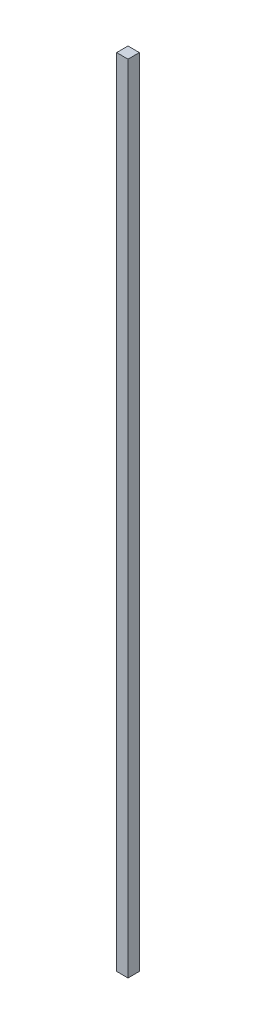
ISO-10303-21;
HEADER;
FILE_DESCRIPTION(('STEP AP214'),'2;1');
FILE_NAME('part.step','',(''),(''),'','','');
FILE_SCHEMA(('AUTOMOTIVE_DESIGN { 1 0 10303 214 1 1 1 1 }'));
ENDSEC;
DATA;
#1=APPLICATION_CONTEXT('core data for automotive mechanical design processes');
#2=APPLICATION_PROTOCOL_DEFINITION('international standard','automotive_design',2000,#1);
#3=PRODUCT_CONTEXT('',#1,'mechanical');
#4=PRODUCT('Part','Part','',(#3));
#5=PRODUCT_RELATED_PRODUCT_CATEGORY('part','',(#4));
#6=PRODUCT_DEFINITION_FORMATION('','',#4);
#7=PRODUCT_DEFINITION_CONTEXT('part definition',#1,'design');
#8=PRODUCT_DEFINITION('design','',#6,#7);
#9=PRODUCT_DEFINITION_SHAPE('','',#8);
#10=(LENGTH_UNIT() NAMED_UNIT(*) SI_UNIT(.MILLI.,.METRE.));
#11=(NAMED_UNIT(*) PLANE_ANGLE_UNIT() SI_UNIT($,.RADIAN.));
#12=(NAMED_UNIT(*) SI_UNIT($,.STERADIAN.) SOLID_ANGLE_UNIT());
#13=UNCERTAINTY_MEASURE_WITH_UNIT(LENGTH_MEASURE(1.E-05),#10,'distance_accuracy_value','');
#14=(GEOMETRIC_REPRESENTATION_CONTEXT(3) GLOBAL_UNCERTAINTY_ASSIGNED_CONTEXT((#13)) GLOBAL_UNIT_ASSIGNED_CONTEXT((#10,
#11,#12)) REPRESENTATION_CONTEXT('',''));
#15=CARTESIAN_POINT('',(0.,0.,0.));
#16=DIRECTION('',(0.,0.,1.));
#17=DIRECTION('',(1.,0.,0.));
#18=AXIS2_PLACEMENT_3D('',#15,#16,#17);
#19=CARTESIAN_POINT('',(-3.,420.,-3.));
#20=DIRECTION('',(1.,0.,0.));
#21=DIRECTION('',(0.,0.,-1.));
#22=AXIS2_PLACEMENT_3D('',#19,#20,#21);
#23=PLANE('',#22);
#24=DIRECTION('',(0.,0.,1.));
#25=VECTOR('',#24,1.);
#26=CARTESIAN_POINT('',(-3.,0.,-3.));
#27=LINE('',#26,#25);
#28=CARTESIAN_POINT('',(-3.,0.,-3.));
#29=VERTEX_POINT('',#28);
#30=CARTESIAN_POINT('',(-3.,0.,3.));
#31=VERTEX_POINT('',#30);
#32=EDGE_CURVE('E96',#29,#31,#27,.T.);
#33=ORIENTED_EDGE('',*,*,#32,.T.);
#34=DIRECTION('',(0.,-1.,0.));
#35=VECTOR('',#34,1.);
#36=CARTESIAN_POINT('',(-3.,420.,3.));
#37=LINE('',#36,#35);
#38=CARTESIAN_POINT('',(-3.,420.,3.));
#39=VERTEX_POINT('',#38);
#40=EDGE_CURVE('E11',#39,#31,#37,.T.);
#41=ORIENTED_EDGE('',*,*,#40,.F.);
#42=DIRECTION('',(0.,0.,1.));
#43=VECTOR('',#42,1.);
#44=CARTESIAN_POINT('',(-3.,420.,-3.));
#45=LINE('',#44,#43);
#46=CARTESIAN_POINT('',(-3.,420.,-3.));
#47=VERTEX_POINT('',#46);
#48=EDGE_CURVE('E84',#47,#39,#45,.T.);
#49=ORIENTED_EDGE('',*,*,#48,.F.);
#50=DIRECTION('',(0.,-1.,0.));
#51=VECTOR('',#50,1.);
#52=CARTESIAN_POINT('',(-3.,420.,-3.));
#53=LINE('',#52,#51);
#54=EDGE_CURVE('E92',#47,#29,#53,.T.);
#55=ORIENTED_EDGE('',*,*,#54,.T.);
#56=EDGE_LOOP('',(#33,#41,#49,#55));
#57=FACE_BOUND('',#56,.T.);
#58=ADVANCED_FACE('F33',(#57),#23,.F.);
#59=CARTESIAN_POINT('',(3.,420.,3.));
#60=DIRECTION('',(0.,0.,-1.));
#61=DIRECTION('',(-1.,0.,0.));
#62=AXIS2_PLACEMENT_3D('',#59,#60,#61);
#63=PLANE('',#62);
#64=DIRECTION('',(1.,0.,0.));
#65=VECTOR('',#64,1.);
#66=CARTESIAN_POINT('',(3.,0.,3.));
#67=LINE('',#66,#65);
#68=CARTESIAN_POINT('',(3.,0.,3.));
#69=VERTEX_POINT('',#68);
#70=EDGE_CURVE('E88',#31,#69,#67,.T.);
#71=ORIENTED_EDGE('',*,*,#70,.T.);
#72=DIRECTION('',(0.,-1.,0.));
#73=VECTOR('',#72,1.);
#74=CARTESIAN_POINT('',(3.,420.,3.));
#75=LINE('',#74,#73);
#76=CARTESIAN_POINT('',(3.,420.,3.));
#77=VERTEX_POINT('',#76);
#78=EDGE_CURVE('E41',#77,#69,#75,.T.);
#79=ORIENTED_EDGE('',*,*,#78,.F.);
#80=DIRECTION('',(1.,0.,0.));
#81=VECTOR('',#80,1.);
#82=CARTESIAN_POINT('',(3.,420.,3.));
#83=LINE('',#82,#81);
#84=EDGE_CURVE('E79',#39,#77,#83,.T.);
#85=ORIENTED_EDGE('',*,*,#84,.F.);
#86=ORIENTED_EDGE('',*,*,#40,.T.);
#87=EDGE_LOOP('',(#71,#79,#85,#86));
#88=FACE_BOUND('',#87,.T.);
#89=ADVANCED_FACE('F87',(#88),#63,.F.);
#90=CARTESIAN_POINT('',(3.,420.,-3.));
#91=DIRECTION('',(-1.,0.,0.));
#92=DIRECTION('',(0.,0.,1.));
#93=AXIS2_PLACEMENT_3D('',#90,#91,#92);
#94=PLANE('',#93);
#95=DIRECTION('',(0.,0.,-1.));
#96=VECTOR('',#95,1.);
#97=CARTESIAN_POINT('',(3.,0.,-3.));
#98=LINE('',#97,#96);
#99=CARTESIAN_POINT('',(3.,0.,-3.));
#100=VERTEX_POINT('',#99);
#101=EDGE_CURVE('E66',#69,#100,#98,.T.);
#102=ORIENTED_EDGE('',*,*,#101,.T.);
#103=DIRECTION('',(0.,-1.,0.));
#104=VECTOR('',#103,1.);
#105=CARTESIAN_POINT('',(3.,420.,-3.));
#106=LINE('',#105,#104);
#107=CARTESIAN_POINT('',(3.,420.,-3.));
#108=VERTEX_POINT('',#107);
#109=EDGE_CURVE('E89',#108,#100,#106,.T.);
#110=ORIENTED_EDGE('',*,*,#109,.F.);
#111=DIRECTION('',(0.,0.,-1.));
#112=VECTOR('',#111,1.);
#113=CARTESIAN_POINT('',(3.,420.,-3.));
#114=LINE('',#113,#112);
#115=EDGE_CURVE('E82',#77,#108,#114,.T.);
#116=ORIENTED_EDGE('',*,*,#115,.F.);
#117=ORIENTED_EDGE('',*,*,#78,.T.);
#118=EDGE_LOOP('',(#102,#110,#116,#117));
#119=FACE_BOUND('',#118,.T.);
#120=ADVANCED_FACE('F90',(#119),#94,.F.);
#121=CARTESIAN_POINT('',(3.,420.,-3.));
#122=DIRECTION('',(0.,0.,1.));
#123=DIRECTION('',(1.,0.,0.));
#124=AXIS2_PLACEMENT_3D('',#121,#122,#123);
#125=PLANE('',#124);
#126=DIRECTION('',(-1.,0.,0.));
#127=VECTOR('',#126,1.);
#128=CARTESIAN_POINT('',(3.,0.,-3.));
#129=LINE('',#128,#127);
#130=EDGE_CURVE('E72',#100,#29,#129,.T.);
#131=ORIENTED_EDGE('',*,*,#130,.T.);
#132=ORIENTED_EDGE('',*,*,#54,.F.);
#133=DIRECTION('',(-1.,0.,0.));
#134=VECTOR('',#133,1.);
#135=CARTESIAN_POINT('',(3.,420.,-3.));
#136=LINE('',#135,#134);
#137=EDGE_CURVE('E49',#108,#47,#136,.T.);
#138=ORIENTED_EDGE('',*,*,#137,.F.);
#139=ORIENTED_EDGE('',*,*,#109,.T.);
#140=EDGE_LOOP('',(#131,#132,#138,#139));
#141=FACE_BOUND('',#140,.T.);
#142=ADVANCED_FACE('F103',(#141),#125,.F.);
#143=CARTESIAN_POINT('',(0.,420.,0.));
#144=DIRECTION('',(0.,-1.,0.));
#145=DIRECTION('',(0.,0.,-1.));
#146=AXIS2_PLACEMENT_3D('',#143,#144,#145);
#147=PLANE('',#146);
#148=ORIENTED_EDGE('',*,*,#48,.T.);
#149=ORIENTED_EDGE('',*,*,#84,.T.);
#150=ORIENTED_EDGE('',*,*,#115,.T.);
#151=ORIENTED_EDGE('',*,*,#137,.T.);
#152=EDGE_LOOP('',(#148,#149,#150,#151));
#153=FACE_BOUND('',#152,.T.);
#154=ADVANCED_FACE('F80',(#153),#147,.F.);
#155=CARTESIAN_POINT('',(0.,0.,0.));
#156=DIRECTION('',(0.,-1.,0.));
#157=DIRECTION('',(0.,0.,-1.));
#158=AXIS2_PLACEMENT_3D('',#155,#156,#157);
#159=PLANE('',#158);
#160=ORIENTED_EDGE('',*,*,#32,.F.);
#161=ORIENTED_EDGE('',*,*,#130,.F.);
#162=ORIENTED_EDGE('',*,*,#101,.F.);
#163=ORIENTED_EDGE('',*,*,#70,.F.);
#164=EDGE_LOOP('',(#160,#161,#162,#163));
#165=FACE_BOUND('',#164,.T.);
#166=ADVANCED_FACE('F106',(#165),#159,.T.);
#167=CLOSED_SHELL('',(#58,#89,#120,#142,#154,#166));
#168=MANIFOLD_SOLID_BREP('B2',#167);
#169=ADVANCED_BREP_SHAPE_REPRESENTATION('',(#18,#168),#14);
#170=SHAPE_DEFINITION_REPRESENTATION(#9,#169);
ENDSEC;
END-ISO-10303-21;
